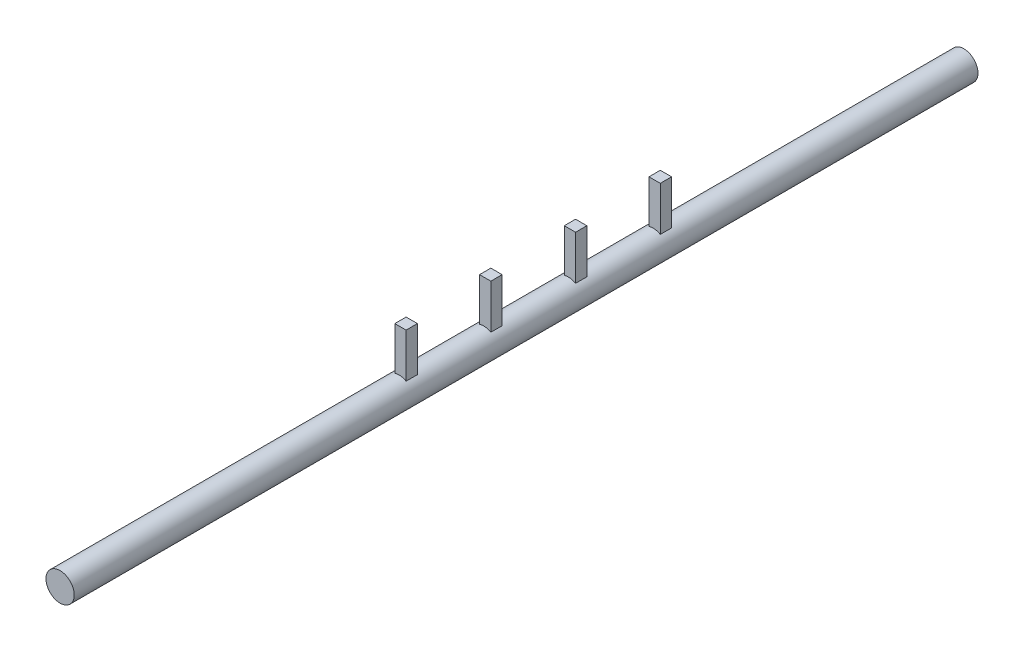
ISO-10303-21;
HEADER;
FILE_DESCRIPTION(('STEP AP214'),'2;1');
FILE_NAME('part.step','',(''),(''),'','','');
FILE_SCHEMA(('AUTOMOTIVE_DESIGN { 1 0 10303 214 1 1 1 1 }'));
ENDSEC;
DATA;
#1=APPLICATION_CONTEXT('core data for automotive mechanical design processes');
#2=APPLICATION_PROTOCOL_DEFINITION('international standard','automotive_design',2000,#1);
#3=PRODUCT_CONTEXT('',#1,'mechanical');
#4=PRODUCT('Part','Part','',(#3));
#5=PRODUCT_RELATED_PRODUCT_CATEGORY('part','',(#4));
#6=PRODUCT_DEFINITION_FORMATION('','',#4);
#7=PRODUCT_DEFINITION_CONTEXT('part definition',#1,'design');
#8=PRODUCT_DEFINITION('design','',#6,#7);
#9=PRODUCT_DEFINITION_SHAPE('','',#8);
#10=(LENGTH_UNIT() NAMED_UNIT(*) SI_UNIT(.MILLI.,.METRE.));
#11=(NAMED_UNIT(*) PLANE_ANGLE_UNIT() SI_UNIT($,.RADIAN.));
#12=(NAMED_UNIT(*) SI_UNIT($,.STERADIAN.) SOLID_ANGLE_UNIT());
#13=UNCERTAINTY_MEASURE_WITH_UNIT(LENGTH_MEASURE(1.E-05),#10,'distance_accuracy_value','');
#14=(GEOMETRIC_REPRESENTATION_CONTEXT(3) GLOBAL_UNCERTAINTY_ASSIGNED_CONTEXT((#13)) GLOBAL_UNIT_ASSIGNED_CONTEXT((#10,
#11,#12)) REPRESENTATION_CONTEXT('',''));
#15=CARTESIAN_POINT('',(0.,0.,0.));
#16=DIRECTION('',(0.,0.,1.));
#17=DIRECTION('',(1.,0.,0.));
#18=AXIS2_PLACEMENT_3D('',#15,#16,#17);
#19=CARTESIAN_POINT('',(0.,0.,203.2));
#20=DIRECTION('',(0.,0.,-1.));
#21=DIRECTION('',(-1.,0.,0.));
#22=AXIS2_PLACEMENT_3D('',#19,#20,#21);
#23=CYLINDRICAL_SURFACE('',#22,3.175);
#24=DIRECTION('',(0.,0.,-1.));
#25=VECTOR('',#24,1.);
#26=CARTESIAN_POINT('',(-0.946747637968448,3.03055999940624,203.2));
#27=LINE('',#26,#25);
#28=CARTESIAN_POINT('',(-0.946747637968447,3.03055999940624,86.36));
#29=VERTEX_POINT('',#28);
#30=CARTESIAN_POINT('',(-0.946747637968447,3.03055999940624,88.9));
#31=VERTEX_POINT('',#30);
#32=EDGE_CURVE('E317',#29,#31,#27,.F.);
#33=ORIENTED_EDGE('',*,*,#32,.F.);
#34=CARTESIAN_POINT('',(0.,0.,86.36));
#35=DIRECTION('',(0.,0.,1.));
#36=DIRECTION('',(1.,0.,0.));
#37=AXIS2_PLACEMENT_3D('',#34,#35,#36);
#38=CIRCLE('',#37,3.175);
#39=CARTESIAN_POINT('',(1.59325236203155,2.74630149671897,86.36));
#40=VERTEX_POINT('',#39);
#41=EDGE_CURVE('E305',#40,#29,#38,.T.);
#42=ORIENTED_EDGE('',*,*,#41,.F.);
#43=DIRECTION('',(0.,0.,-1.));
#44=VECTOR('',#43,1.);
#45=CARTESIAN_POINT('',(1.59325236203155,2.74630149671897,203.2));
#46=LINE('',#45,#44);
#47=CARTESIAN_POINT('',(1.59325236203155,2.74630149671897,88.9));
#48=VERTEX_POINT('',#47);
#49=EDGE_CURVE('E309',#48,#40,#46,.T.);
#50=ORIENTED_EDGE('',*,*,#49,.F.);
#51=CARTESIAN_POINT('',(0.,0.,88.9));
#52=DIRECTION('',(0.,0.,-1.));
#53=DIRECTION('',(-1.,0.,0.));
#54=AXIS2_PLACEMENT_3D('',#51,#52,#53);
#55=CIRCLE('',#54,3.175);
#56=EDGE_CURVE('E313',#31,#48,#55,.T.);
#57=ORIENTED_EDGE('',*,*,#56,.F.);
#58=EDGE_LOOP('',(#33,#42,#50,#57));
#59=FACE_BOUND('',#58,.T.);
#60=DIRECTION('',(0.,0.,-1.));
#61=VECTOR('',#60,1.);
#62=CARTESIAN_POINT('',(-0.946747637968315,3.03055999940628,203.2));
#63=LINE('',#62,#61);
#64=CARTESIAN_POINT('',(-0.946747637968314,3.03055999940628,124.46));
#65=VERTEX_POINT('',#64);
#66=CARTESIAN_POINT('',(-0.946747637968314,3.03055999940628,127.));
#67=VERTEX_POINT('',#66);
#68=EDGE_CURVE('E285',#65,#67,#63,.F.);
#69=ORIENTED_EDGE('',*,*,#68,.F.);
#70=CARTESIAN_POINT('',(0.,0.,124.46));
#71=DIRECTION('',(0.,0.,1.));
#72=DIRECTION('',(1.,0.,0.));
#73=AXIS2_PLACEMENT_3D('',#70,#71,#72);
#74=CIRCLE('',#73,3.175);
#75=CARTESIAN_POINT('',(1.59325236203168,2.7463014967189,124.46));
#76=VERTEX_POINT('',#75);
#77=EDGE_CURVE('E270',#76,#65,#74,.T.);
#78=ORIENTED_EDGE('',*,*,#77,.F.);
#79=DIRECTION('',(0.,0.,-1.));
#80=VECTOR('',#79,1.);
#81=CARTESIAN_POINT('',(1.59325236203169,2.7463014967189,203.2));
#82=LINE('',#81,#80);
#83=CARTESIAN_POINT('',(1.59325236203169,2.7463014967189,127.));
#84=VERTEX_POINT('',#83);
#85=EDGE_CURVE('E277',#84,#76,#82,.T.);
#86=ORIENTED_EDGE('',*,*,#85,.F.);
#87=CARTESIAN_POINT('',(0.,0.,127.));
#88=DIRECTION('',(0.,0.,-1.));
#89=DIRECTION('',(-1.,0.,0.));
#90=AXIS2_PLACEMENT_3D('',#87,#88,#89);
#91=CIRCLE('',#90,3.175);
#92=EDGE_CURVE('E281',#67,#84,#91,.T.);
#93=ORIENTED_EDGE('',*,*,#92,.F.);
#94=EDGE_LOOP('',(#69,#78,#86,#93));
#95=FACE_BOUND('',#94,.T.);
#96=CARTESIAN_POINT('',(0.,0.,203.2));
#97=DIRECTION('',(0.,0.,1.));
#98=DIRECTION('',(1.,0.,0.));
#99=AXIS2_PLACEMENT_3D('',#96,#97,#98);
#100=CIRCLE('',#99,3.175);
#101=CARTESIAN_POINT('',(3.175,0.,203.2));
#102=VERTEX_POINT('',#101);
#103=EDGE_CURVE('E266',#102,#102,#100,.T.);
#104=ORIENTED_EDGE('',*,*,#103,.F.);
#105=EDGE_LOOP('',(#104));
#106=FACE_BOUND('',#105,.T.);
#107=CARTESIAN_POINT('',(0.,0.,0.));
#108=DIRECTION('',(0.,0.,1.));
#109=DIRECTION('',(1.,0.,0.));
#110=AXIS2_PLACEMENT_3D('',#107,#108,#109);
#111=CIRCLE('',#110,3.175);
#112=CARTESIAN_POINT('',(3.175,0.,0.));
#113=VERTEX_POINT('',#112);
#114=EDGE_CURVE('E265',#113,#113,#111,.T.);
#115=ORIENTED_EDGE('',*,*,#114,.T.);
#116=EDGE_LOOP('',(#115));
#117=FACE_BOUND('',#116,.T.);
#118=DIRECTION('',(0.,0.,-1.));
#119=VECTOR('',#118,1.);
#120=CARTESIAN_POINT('',(-0.946747637968381,3.03055999940626,203.2));
#121=LINE('',#120,#119);
#122=CARTESIAN_POINT('',(-0.946747637968381,3.03055999940626,105.41));
#123=VERTEX_POINT('',#122);
#124=CARTESIAN_POINT('',(-0.946747637968381,3.03055999940626,107.95));
#125=VERTEX_POINT('',#124);
#126=EDGE_CURVE('E301',#123,#125,#121,.F.);
#127=ORIENTED_EDGE('',*,*,#126,.F.);
#128=CARTESIAN_POINT('',(0.,0.,105.41));
#129=DIRECTION('',(0.,0.,1.));
#130=DIRECTION('',(1.,0.,0.));
#131=AXIS2_PLACEMENT_3D('',#128,#129,#130);
#132=CIRCLE('',#131,3.175);
#133=CARTESIAN_POINT('',(1.59325236203162,2.74630149671894,105.41));
#134=VERTEX_POINT('',#133);
#135=EDGE_CURVE('E289',#134,#123,#132,.T.);
#136=ORIENTED_EDGE('',*,*,#135,.F.);
#137=DIRECTION('',(0.,0.,-1.));
#138=VECTOR('',#137,1.);
#139=CARTESIAN_POINT('',(1.59325236203162,2.74630149671894,203.2));
#140=LINE('',#139,#138);
#141=CARTESIAN_POINT('',(1.59325236203162,2.74630149671894,107.95));
#142=VERTEX_POINT('',#141);
#143=EDGE_CURVE('E293',#142,#134,#140,.T.);
#144=ORIENTED_EDGE('',*,*,#143,.F.);
#145=CARTESIAN_POINT('',(0.,0.,107.95));
#146=DIRECTION('',(0.,0.,-1.));
#147=DIRECTION('',(-1.,0.,0.));
#148=AXIS2_PLACEMENT_3D('',#145,#146,#147);
#149=CIRCLE('',#148,3.175);
#150=EDGE_CURVE('E297',#125,#142,#149,.T.);
#151=ORIENTED_EDGE('',*,*,#150,.F.);
#152=EDGE_LOOP('',(#127,#136,#144,#151));
#153=FACE_BOUND('',#152,.T.);
#154=DIRECTION('',(0.,0.,-1.));
#155=VECTOR('',#154,1.);
#156=CARTESIAN_POINT('',(-0.946747637968514,3.03055999940622,203.2));
#157=LINE('',#156,#155);
#158=CARTESIAN_POINT('',(-0.946747637968514,3.03055999940622,67.31));
#159=VERTEX_POINT('',#158);
#160=CARTESIAN_POINT('',(-0.946747637968514,3.03055999940622,69.85));
#161=VERTEX_POINT('',#160);
#162=EDGE_CURVE('E11',#159,#161,#157,.F.);
#163=ORIENTED_EDGE('',*,*,#162,.F.);
#164=CARTESIAN_POINT('',(0.,0.,67.31));
#165=DIRECTION('',(0.,0.,1.));
#166=DIRECTION('',(1.,0.,0.));
#167=AXIS2_PLACEMENT_3D('',#164,#165,#166);
#168=CIRCLE('',#167,3.175);
#169=CARTESIAN_POINT('',(1.59325236203149,2.74630149671901,67.31));
#170=VERTEX_POINT('',#169);
#171=EDGE_CURVE('E321',#170,#159,#168,.T.);
#172=ORIENTED_EDGE('',*,*,#171,.F.);
#173=DIRECTION('',(0.,0.,-1.));
#174=VECTOR('',#173,1.);
#175=CARTESIAN_POINT('',(1.59325236203149,2.74630149671901,203.2));
#176=LINE('',#175,#174);
#177=CARTESIAN_POINT('',(1.59325236203149,2.74630149671901,69.85));
#178=VERTEX_POINT('',#177);
#179=EDGE_CURVE('E57',#178,#170,#176,.T.);
#180=ORIENTED_EDGE('',*,*,#179,.F.);
#181=CARTESIAN_POINT('',(0.,0.,69.85));
#182=DIRECTION('',(0.,0.,-1.));
#183=DIRECTION('',(-1.,0.,0.));
#184=AXIS2_PLACEMENT_3D('',#181,#182,#183);
#185=CIRCLE('',#184,3.175);
#186=EDGE_CURVE('E47',#161,#178,#185,.T.);
#187=ORIENTED_EDGE('',*,*,#186,.F.);
#188=EDGE_LOOP('',(#163,#172,#180,#187));
#189=FACE_BOUND('',#188,.T.);
#190=ADVANCED_FACE('F39',(#59,#95,#106,#117,#153,#189),#23,.T.);
#191=CARTESIAN_POINT('',(0.,0.,203.2));
#192=DIRECTION('',(0.,0.,1.));
#193=DIRECTION('',(1.,0.,0.));
#194=AXIS2_PLACEMENT_3D('',#191,#192,#193);
#195=PLANE('',#194);
#196=ORIENTED_EDGE('',*,*,#103,.T.);
#197=EDGE_LOOP('',(#196));
#198=FACE_BOUND('',#197,.T.);
#199=ADVANCED_FACE('F342',(#198),#195,.T.);
#200=CARTESIAN_POINT('',(0.,0.,0.));
#201=DIRECTION('',(0.,0.,1.));
#202=DIRECTION('',(1.,0.,0.));
#203=AXIS2_PLACEMENT_3D('',#200,#201,#202);
#204=PLANE('',#203);
#205=ORIENTED_EDGE('',*,*,#114,.F.);
#206=EDGE_LOOP('',(#205));
#207=FACE_BOUND('',#206,.T.);
#208=ADVANCED_FACE('F349',(#207),#204,.F.);
#209=CARTESIAN_POINT('',(-0.946747637968315,12.7,127.));
#210=DIRECTION('',(1.,0.,0.));
#211=DIRECTION('',(0.,0.,-1.));
#212=AXIS2_PLACEMENT_3D('',#209,#210,#211);
#213=PLANE('',#212);
#214=DIRECTION('',(0.,-1.,0.));
#215=VECTOR('',#214,1.);
#216=CARTESIAN_POINT('',(-0.946747637968315,12.7,124.46));
#217=LINE('',#216,#215);
#218=CARTESIAN_POINT('',(-0.946747637968315,12.7,124.46));
#219=VERTEX_POINT('',#218);
#220=EDGE_CURVE('E249',#219,#65,#217,.T.);
#221=ORIENTED_EDGE('',*,*,#220,.T.);
#222=ORIENTED_EDGE('',*,*,#68,.T.);
#223=DIRECTION('',(0.,-1.,0.));
#224=VECTOR('',#223,1.);
#225=CARTESIAN_POINT('',(-0.946747637968315,12.7,127.));
#226=LINE('',#225,#224);
#227=CARTESIAN_POINT('',(-0.946747637968315,12.7,127.));
#228=VERTEX_POINT('',#227);
#229=EDGE_CURVE('E261',#228,#67,#226,.T.);
#230=ORIENTED_EDGE('',*,*,#229,.F.);
#231=DIRECTION('',(0.,0.,1.));
#232=VECTOR('',#231,1.);
#233=CARTESIAN_POINT('',(-0.946747637968315,12.7,127.));
#234=LINE('',#233,#232);
#235=EDGE_CURVE('E236',#219,#228,#234,.T.);
#236=ORIENTED_EDGE('',*,*,#235,.F.);
#237=EDGE_LOOP('',(#221,#222,#230,#236));
#238=FACE_BOUND('',#237,.T.);
#239=ADVANCED_FACE('F398',(#238),#213,.F.);
#240=CARTESIAN_POINT('',(1.59325236203169,12.7,127.));
#241=DIRECTION('',(-1.,0.,0.));
#242=DIRECTION('',(0.,0.,1.));
#243=AXIS2_PLACEMENT_3D('',#240,#241,#242);
#244=PLANE('',#243);
#245=DIRECTION('',(0.,-1.,0.));
#246=VECTOR('',#245,1.);
#247=CARTESIAN_POINT('',(1.59325236203169,12.7,127.));
#248=LINE('',#247,#246);
#249=CARTESIAN_POINT('',(1.59325236203169,12.7,127.));
#250=VERTEX_POINT('',#249);
#251=EDGE_CURVE('E257',#250,#84,#248,.T.);
#252=ORIENTED_EDGE('',*,*,#251,.T.);
#253=ORIENTED_EDGE('',*,*,#85,.T.);
#254=DIRECTION('',(0.,-1.,0.));
#255=VECTOR('',#254,1.);
#256=CARTESIAN_POINT('',(1.59325236203169,12.7,124.46));
#257=LINE('',#256,#255);
#258=CARTESIAN_POINT('',(1.59325236203169,12.7,124.46));
#259=VERTEX_POINT('',#258);
#260=EDGE_CURVE('E253',#259,#76,#257,.T.);
#261=ORIENTED_EDGE('',*,*,#260,.F.);
#262=DIRECTION('',(0.,0.,-1.));
#263=VECTOR('',#262,1.);
#264=CARTESIAN_POINT('',(1.59325236203169,12.7,127.));
#265=LINE('',#264,#263);
#266=EDGE_CURVE('E243',#250,#259,#265,.T.);
#267=ORIENTED_EDGE('',*,*,#266,.F.);
#268=EDGE_LOOP('',(#252,#253,#261,#267));
#269=FACE_BOUND('',#268,.T.);
#270=ADVANCED_FACE('F395',(#269),#244,.F.);
#271=CARTESIAN_POINT('',(-0.946747637968315,12.7,127.));
#272=DIRECTION('',(0.,0.,-1.));
#273=DIRECTION('',(-1.,0.,0.));
#274=AXIS2_PLACEMENT_3D('',#271,#272,#273);
#275=PLANE('',#274);
#276=ORIENTED_EDGE('',*,*,#229,.T.);
#277=ORIENTED_EDGE('',*,*,#92,.T.);
#278=ORIENTED_EDGE('',*,*,#251,.F.);
#279=DIRECTION('',(1.,0.,0.));
#280=VECTOR('',#279,1.);
#281=CARTESIAN_POINT('',(-0.946747637968315,12.7,127.));
#282=LINE('',#281,#280);
#283=EDGE_CURVE('E240',#228,#250,#282,.T.);
#284=ORIENTED_EDGE('',*,*,#283,.F.);
#285=EDGE_LOOP('',(#276,#277,#278,#284));
#286=FACE_BOUND('',#285,.T.);
#287=ADVANCED_FACE('F393',(#286),#275,.F.);
#288=CARTESIAN_POINT('',(-0.946747637968315,12.7,124.46));
#289=DIRECTION('',(0.,0.,1.));
#290=DIRECTION('',(1.,0.,0.));
#291=AXIS2_PLACEMENT_3D('',#288,#289,#290);
#292=PLANE('',#291);
#293=ORIENTED_EDGE('',*,*,#260,.T.);
#294=ORIENTED_EDGE('',*,*,#77,.T.);
#295=ORIENTED_EDGE('',*,*,#220,.F.);
#296=DIRECTION('',(-1.,0.,0.));
#297=VECTOR('',#296,1.);
#298=CARTESIAN_POINT('',(-0.946747637968315,12.7,124.46));
#299=LINE('',#298,#297);
#300=EDGE_CURVE('E246',#259,#219,#299,.T.);
#301=ORIENTED_EDGE('',*,*,#300,.F.);
#302=EDGE_LOOP('',(#293,#294,#295,#301));
#303=FACE_BOUND('',#302,.T.);
#304=ADVANCED_FACE('F389',(#303),#292,.F.);
#305=CARTESIAN_POINT('',(0.,12.7,0.));
#306=DIRECTION('',(0.,-1.,0.));
#307=DIRECTION('',(0.,0.,-1.));
#308=AXIS2_PLACEMENT_3D('',#305,#306,#307);
#309=PLANE('',#308);
#310=ORIENTED_EDGE('',*,*,#235,.T.);
#311=ORIENTED_EDGE('',*,*,#283,.T.);
#312=ORIENTED_EDGE('',*,*,#266,.T.);
#313=ORIENTED_EDGE('',*,*,#300,.T.);
#314=EDGE_LOOP('',(#310,#311,#312,#313));
#315=FACE_BOUND('',#314,.T.);
#316=ADVANCED_FACE('F386',(#315),#309,.F.);
#317=CARTESIAN_POINT('',(-0.946747637968381,12.7,107.95));
#318=DIRECTION('',(1.,0.,0.));
#319=DIRECTION('',(0.,0.,-1.));
#320=AXIS2_PLACEMENT_3D('',#317,#318,#319);
#321=PLANE('',#320);
#322=DIRECTION('',(0.,-1.,0.));
#323=VECTOR('',#322,1.);
#324=CARTESIAN_POINT('',(-0.946747637968381,12.7,105.41));
#325=LINE('',#324,#323);
#326=CARTESIAN_POINT('',(-0.946747637968381,12.7,105.41));
#327=VERTEX_POINT('',#326);
#328=EDGE_CURVE('E220',#327,#123,#325,.T.);
#329=ORIENTED_EDGE('',*,*,#328,.T.);
#330=ORIENTED_EDGE('',*,*,#126,.T.);
#331=DIRECTION('',(0.,-1.,0.));
#332=VECTOR('',#331,1.);
#333=CARTESIAN_POINT('',(-0.946747637968381,12.7,107.95));
#334=LINE('',#333,#332);
#335=CARTESIAN_POINT('',(-0.946747637968381,12.7,107.95));
#336=VERTEX_POINT('',#335);
#337=EDGE_CURVE('E232',#336,#125,#334,.T.);
#338=ORIENTED_EDGE('',*,*,#337,.F.);
#339=DIRECTION('',(0.,0.,1.));
#340=VECTOR('',#339,1.);
#341=CARTESIAN_POINT('',(-0.946747637968381,12.7,107.95));
#342=LINE('',#341,#340);
#343=EDGE_CURVE('E207',#327,#336,#342,.T.);
#344=ORIENTED_EDGE('',*,*,#343,.F.);
#345=EDGE_LOOP('',(#329,#330,#338,#344));
#346=FACE_BOUND('',#345,.T.);
#347=ADVANCED_FACE('F366',(#346),#321,.F.);
#348=CARTESIAN_POINT('',(1.59325236203162,12.7,107.95));
#349=DIRECTION('',(-1.,0.,0.));
#350=DIRECTION('',(0.,0.,1.));
#351=AXIS2_PLACEMENT_3D('',#348,#349,#350);
#352=PLANE('',#351);
#353=DIRECTION('',(0.,-1.,0.));
#354=VECTOR('',#353,1.);
#355=CARTESIAN_POINT('',(1.59325236203162,12.7,107.95));
#356=LINE('',#355,#354);
#357=CARTESIAN_POINT('',(1.59325236203162,12.7,107.95));
#358=VERTEX_POINT('',#357);
#359=EDGE_CURVE('E228',#358,#142,#356,.T.);
#360=ORIENTED_EDGE('',*,*,#359,.T.);
#361=ORIENTED_EDGE('',*,*,#143,.T.);
#362=DIRECTION('',(0.,-1.,0.));
#363=VECTOR('',#362,1.);
#364=CARTESIAN_POINT('',(1.59325236203162,12.7,105.41));
#365=LINE('',#364,#363);
#366=CARTESIAN_POINT('',(1.59325236203162,12.7,105.41));
#367=VERTEX_POINT('',#366);
#368=EDGE_CURVE('E224',#367,#134,#365,.T.);
#369=ORIENTED_EDGE('',*,*,#368,.F.);
#370=DIRECTION('',(0.,0.,-1.));
#371=VECTOR('',#370,1.);
#372=CARTESIAN_POINT('',(1.59325236203162,12.7,107.95));
#373=LINE('',#372,#371);
#374=EDGE_CURVE('E214',#358,#367,#373,.T.);
#375=ORIENTED_EDGE('',*,*,#374,.F.);
#376=EDGE_LOOP('',(#360,#361,#369,#375));
#377=FACE_BOUND('',#376,.T.);
#378=ADVANCED_FACE('F372',(#377),#352,.F.);
#379=CARTESIAN_POINT('',(-0.946747637968381,12.7,107.95));
#380=DIRECTION('',(0.,0.,-1.));
#381=DIRECTION('',(-1.,0.,0.));
#382=AXIS2_PLACEMENT_3D('',#379,#380,#381);
#383=PLANE('',#382);
#384=ORIENTED_EDGE('',*,*,#337,.T.);
#385=ORIENTED_EDGE('',*,*,#150,.T.);
#386=ORIENTED_EDGE('',*,*,#359,.F.);
#387=DIRECTION('',(1.,0.,0.));
#388=VECTOR('',#387,1.);
#389=CARTESIAN_POINT('',(-0.946747637968381,12.7,107.95));
#390=LINE('',#389,#388);
#391=EDGE_CURVE('E211',#336,#358,#390,.T.);
#392=ORIENTED_EDGE('',*,*,#391,.F.);
#393=EDGE_LOOP('',(#384,#385,#386,#392));
#394=FACE_BOUND('',#393,.T.);
#395=ADVANCED_FACE('F374',(#394),#383,.F.);
#396=CARTESIAN_POINT('',(-0.946747637968381,12.7,105.41));
#397=DIRECTION('',(0.,0.,1.));
#398=DIRECTION('',(1.,0.,0.));
#399=AXIS2_PLACEMENT_3D('',#396,#397,#398);
#400=PLANE('',#399);
#401=ORIENTED_EDGE('',*,*,#368,.T.);
#402=ORIENTED_EDGE('',*,*,#135,.T.);
#403=ORIENTED_EDGE('',*,*,#328,.F.);
#404=DIRECTION('',(-1.,0.,0.));
#405=VECTOR('',#404,1.);
#406=CARTESIAN_POINT('',(-0.946747637968381,12.7,105.41));
#407=LINE('',#406,#405);
#408=EDGE_CURVE('E217',#367,#327,#407,.T.);
#409=ORIENTED_EDGE('',*,*,#408,.F.);
#410=EDGE_LOOP('',(#401,#402,#403,#409));
#411=FACE_BOUND('',#410,.T.);
#412=ADVANCED_FACE('F362',(#411),#400,.F.);
#413=CARTESIAN_POINT('',(0.,12.7,0.));
#414=DIRECTION('',(0.,-1.,0.));
#415=DIRECTION('',(0.,0.,-1.));
#416=AXIS2_PLACEMENT_3D('',#413,#414,#415);
#417=PLANE('',#416);
#418=ORIENTED_EDGE('',*,*,#343,.T.);
#419=ORIENTED_EDGE('',*,*,#391,.T.);
#420=ORIENTED_EDGE('',*,*,#374,.T.);
#421=ORIENTED_EDGE('',*,*,#408,.T.);
#422=EDGE_LOOP('',(#418,#419,#420,#421));
#423=FACE_BOUND('',#422,.T.);
#424=ADVANCED_FACE('F368',(#423),#417,.F.);
#425=CARTESIAN_POINT('',(-0.946747637968448,12.7,88.9));
#426=DIRECTION('',(1.,0.,0.));
#427=DIRECTION('',(0.,0.,-1.));
#428=AXIS2_PLACEMENT_3D('',#425,#426,#427);
#429=PLANE('',#428);
#430=DIRECTION('',(0.,-1.,0.));
#431=VECTOR('',#430,1.);
#432=CARTESIAN_POINT('',(-0.946747637968448,12.7,86.36));
#433=LINE('',#432,#431);
#434=CARTESIAN_POINT('',(-0.946747637968448,12.7,86.36));
#435=VERTEX_POINT('',#434);
#436=EDGE_CURVE('E191',#435,#29,#433,.T.);
#437=ORIENTED_EDGE('',*,*,#436,.T.);
#438=ORIENTED_EDGE('',*,*,#32,.T.);
#439=DIRECTION('',(0.,-1.,0.));
#440=VECTOR('',#439,1.);
#441=CARTESIAN_POINT('',(-0.946747637968448,12.7,88.9));
#442=LINE('',#441,#440);
#443=CARTESIAN_POINT('',(-0.946747637968448,12.7,88.9));
#444=VERTEX_POINT('',#443);
#445=EDGE_CURVE('E203',#444,#31,#442,.T.);
#446=ORIENTED_EDGE('',*,*,#445,.F.);
#447=DIRECTION('',(0.,0.,1.));
#448=VECTOR('',#447,1.);
#449=CARTESIAN_POINT('',(-0.946747637968448,12.7,88.9));
#450=LINE('',#449,#448);
#451=EDGE_CURVE('E172',#435,#444,#450,.T.);
#452=ORIENTED_EDGE('',*,*,#451,.F.);
#453=EDGE_LOOP('',(#437,#438,#446,#452));
#454=FACE_BOUND('',#453,.T.);
#455=ADVANCED_FACE('F460',(#454),#429,.F.);
#456=CARTESIAN_POINT('',(1.59325236203155,12.7,88.9));
#457=DIRECTION('',(-1.,0.,0.));
#458=DIRECTION('',(0.,0.,1.));
#459=AXIS2_PLACEMENT_3D('',#456,#457,#458);
#460=PLANE('',#459);
#461=DIRECTION('',(0.,-1.,0.));
#462=VECTOR('',#461,1.);
#463=CARTESIAN_POINT('',(1.59325236203155,12.7,88.9));
#464=LINE('',#463,#462);
#465=CARTESIAN_POINT('',(1.59325236203155,12.7,88.9));
#466=VERTEX_POINT('',#465);
#467=EDGE_CURVE('E199',#466,#48,#464,.T.);
#468=ORIENTED_EDGE('',*,*,#467,.T.);
#469=ORIENTED_EDGE('',*,*,#49,.T.);
#470=DIRECTION('',(0.,-1.,0.));
#471=VECTOR('',#470,1.);
#472=CARTESIAN_POINT('',(1.59325236203155,12.7,86.36));
#473=LINE('',#472,#471);
#474=CARTESIAN_POINT('',(1.59325236203155,12.7,86.36));
#475=VERTEX_POINT('',#474);
#476=EDGE_CURVE('E195',#475,#40,#473,.T.);
#477=ORIENTED_EDGE('',*,*,#476,.F.);
#478=DIRECTION('',(0.,0.,-1.));
#479=VECTOR('',#478,1.);
#480=CARTESIAN_POINT('',(1.59325236203155,12.7,88.9));
#481=LINE('',#480,#479);
#482=EDGE_CURVE('E185',#466,#475,#481,.T.);
#483=ORIENTED_EDGE('',*,*,#482,.F.);
#484=EDGE_LOOP('',(#468,#469,#477,#483));
#485=FACE_BOUND('',#484,.T.);
#486=ADVANCED_FACE('F469',(#485),#460,.F.);
#487=CARTESIAN_POINT('',(-0.946747637968448,12.7,88.9));
#488=DIRECTION('',(0.,0.,-1.));
#489=DIRECTION('',(-1.,0.,0.));
#490=AXIS2_PLACEMENT_3D('',#487,#488,#489);
#491=PLANE('',#490);
#492=ORIENTED_EDGE('',*,*,#445,.T.);
#493=ORIENTED_EDGE('',*,*,#56,.T.);
#494=ORIENTED_EDGE('',*,*,#467,.F.);
#495=DIRECTION('',(1.,0.,0.));
#496=VECTOR('',#495,1.);
#497=CARTESIAN_POINT('',(-0.946747637968448,12.7,88.9));
#498=LINE('',#497,#496);
#499=EDGE_CURVE('E177',#444,#466,#498,.T.);
#500=ORIENTED_EDGE('',*,*,#499,.F.);
#501=EDGE_LOOP('',(#492,#493,#494,#500));
#502=FACE_BOUND('',#501,.T.);
#503=ADVANCED_FACE('F479',(#502),#491,.F.);
#504=CARTESIAN_POINT('',(-0.946747637968448,12.7,86.36));
#505=DIRECTION('',(0.,0.,1.));
#506=DIRECTION('',(1.,0.,0.));
#507=AXIS2_PLACEMENT_3D('',#504,#505,#506);
#508=PLANE('',#507);
#509=ORIENTED_EDGE('',*,*,#476,.T.);
#510=ORIENTED_EDGE('',*,*,#41,.T.);
#511=ORIENTED_EDGE('',*,*,#436,.F.);
#512=DIRECTION('',(-1.,0.,0.));
#513=VECTOR('',#512,1.);
#514=CARTESIAN_POINT('',(-0.946747637968448,12.7,86.36));
#515=LINE('',#514,#513);
#516=EDGE_CURVE('E188',#475,#435,#515,.T.);
#517=ORIENTED_EDGE('',*,*,#516,.F.);
#518=EDGE_LOOP('',(#509,#510,#511,#517));
#519=FACE_BOUND('',#518,.T.);
#520=ADVANCED_FACE('F489',(#519),#508,.F.);
#521=CARTESIAN_POINT('',(0.,12.7,0.));
#522=DIRECTION('',(0.,-1.,0.));
#523=DIRECTION('',(0.,0.,-1.));
#524=AXIS2_PLACEMENT_3D('',#521,#522,#523);
#525=PLANE('',#524);
#526=ORIENTED_EDGE('',*,*,#451,.T.);
#527=ORIENTED_EDGE('',*,*,#499,.T.);
#528=ORIENTED_EDGE('',*,*,#482,.T.);
#529=ORIENTED_EDGE('',*,*,#516,.T.);
#530=EDGE_LOOP('',(#526,#527,#528,#529));
#531=FACE_BOUND('',#530,.T.);
#532=ADVANCED_FACE('F499',(#531),#525,.F.);
#533=CARTESIAN_POINT('',(-0.946747637968514,12.7,69.85));
#534=DIRECTION('',(1.,0.,0.));
#535=DIRECTION('',(0.,0.,-1.));
#536=AXIS2_PLACEMENT_3D('',#533,#534,#535);
#537=PLANE('',#536);
#538=DIRECTION('',(0.,-1.,0.));
#539=VECTOR('',#538,1.);
#540=CARTESIAN_POINT('',(-0.946747637968514,12.7,67.31));
#541=LINE('',#540,#539);
#542=CARTESIAN_POINT('',(-0.946747637968514,12.7,67.31));
#543=VERTEX_POINT('',#542);
#544=EDGE_CURVE('E334',#543,#159,#541,.T.);
#545=ORIENTED_EDGE('',*,*,#544,.T.);
#546=ORIENTED_EDGE('',*,*,#162,.T.);
#547=DIRECTION('',(0.,-1.,0.));
#548=VECTOR('',#547,1.);
#549=CARTESIAN_POINT('',(-0.946747637968514,12.7,69.85));
#550=LINE('',#549,#548);
#551=CARTESIAN_POINT('',(-0.946747637968514,12.7,69.85));
#552=VERTEX_POINT('',#551);
#553=EDGE_CURVE('E152',#552,#161,#550,.T.);
#554=ORIENTED_EDGE('',*,*,#553,.F.);
#555=DIRECTION('',(0.,0.,1.));
#556=VECTOR('',#555,1.);
#557=CARTESIAN_POINT('',(-0.946747637968514,12.7,69.85));
#558=LINE('',#557,#556);
#559=EDGE_CURVE('E159',#543,#552,#558,.T.);
#560=ORIENTED_EDGE('',*,*,#559,.F.);
#561=EDGE_LOOP('',(#545,#546,#554,#560));
#562=FACE_BOUND('',#561,.T.);
#563=ADVANCED_FACE('F170',(#562),#537,.F.);
#564=CARTESIAN_POINT('',(1.59325236203149,12.7,69.85));
#565=DIRECTION('',(-1.,0.,0.));
#566=DIRECTION('',(0.,0.,1.));
#567=AXIS2_PLACEMENT_3D('',#564,#565,#566);
#568=PLANE('',#567);
#569=DIRECTION('',(0.,-1.,0.));
#570=VECTOR('',#569,1.);
#571=CARTESIAN_POINT('',(1.59325236203149,12.7,69.85));
#572=LINE('',#571,#570);
#573=CARTESIAN_POINT('',(1.59325236203149,12.7,69.85));
#574=VERTEX_POINT('',#573);
#575=EDGE_CURVE('E154',#574,#178,#572,.T.);
#576=ORIENTED_EDGE('',*,*,#575,.T.);
#577=ORIENTED_EDGE('',*,*,#179,.T.);
#578=DIRECTION('',(0.,-1.,0.));
#579=VECTOR('',#578,1.);
#580=CARTESIAN_POINT('',(1.59325236203149,12.7,67.31));
#581=LINE('',#580,#579);
#582=CARTESIAN_POINT('',(1.59325236203149,12.7,67.31));
#583=VERTEX_POINT('',#582);
#584=EDGE_CURVE('E179',#583,#170,#581,.T.);
#585=ORIENTED_EDGE('',*,*,#584,.F.);
#586=DIRECTION('',(0.,0.,-1.));
#587=VECTOR('',#586,1.);
#588=CARTESIAN_POINT('',(1.59325236203149,12.7,69.85));
#589=LINE('',#588,#587);
#590=EDGE_CURVE('E158',#574,#583,#589,.T.);
#591=ORIENTED_EDGE('',*,*,#590,.F.);
#592=EDGE_LOOP('',(#576,#577,#585,#591));
#593=FACE_BOUND('',#592,.T.);
#594=ADVANCED_FACE('F328',(#593),#568,.F.);
#595=CARTESIAN_POINT('',(-0.946747637968514,12.7,69.85));
#596=DIRECTION('',(0.,0.,-1.));
#597=DIRECTION('',(-1.,0.,0.));
#598=AXIS2_PLACEMENT_3D('',#595,#596,#597);
#599=PLANE('',#598);
#600=ORIENTED_EDGE('',*,*,#553,.T.);
#601=ORIENTED_EDGE('',*,*,#186,.T.);
#602=ORIENTED_EDGE('',*,*,#575,.F.);
#603=DIRECTION('',(1.,0.,0.));
#604=VECTOR('',#603,1.);
#605=CARTESIAN_POINT('',(-0.946747637968514,12.7,69.85));
#606=LINE('',#605,#604);
#607=EDGE_CURVE('E148',#552,#574,#606,.T.);
#608=ORIENTED_EDGE('',*,*,#607,.F.);
#609=EDGE_LOOP('',(#600,#601,#602,#608));
#610=FACE_BOUND('',#609,.T.);
#611=ADVANCED_FACE('F150',(#610),#599,.F.);
#612=CARTESIAN_POINT('',(-0.946747637968514,12.7,67.31));
#613=DIRECTION('',(0.,0.,1.));
#614=DIRECTION('',(1.,0.,0.));
#615=AXIS2_PLACEMENT_3D('',#612,#613,#614);
#616=PLANE('',#615);
#617=ORIENTED_EDGE('',*,*,#584,.T.);
#618=ORIENTED_EDGE('',*,*,#171,.T.);
#619=ORIENTED_EDGE('',*,*,#544,.F.);
#620=DIRECTION('',(-1.,0.,0.));
#621=VECTOR('',#620,1.);
#622=CARTESIAN_POINT('',(-0.946747637968514,12.7,67.31));
#623=LINE('',#622,#621);
#624=EDGE_CURVE('E164',#583,#543,#623,.T.);
#625=ORIENTED_EDGE('',*,*,#624,.F.);
#626=EDGE_LOOP('',(#617,#618,#619,#625));
#627=FACE_BOUND('',#626,.T.);
#628=ADVANCED_FACE('F340',(#627),#616,.F.);
#629=CARTESIAN_POINT('',(0.,12.7,0.));
#630=DIRECTION('',(0.,-1.,0.));
#631=DIRECTION('',(0.,0.,-1.));
#632=AXIS2_PLACEMENT_3D('',#629,#630,#631);
#633=PLANE('',#632);
#634=ORIENTED_EDGE('',*,*,#559,.T.);
#635=ORIENTED_EDGE('',*,*,#607,.T.);
#636=ORIENTED_EDGE('',*,*,#590,.T.);
#637=ORIENTED_EDGE('',*,*,#624,.T.);
#638=EDGE_LOOP('',(#634,#635,#636,#637));
#639=FACE_BOUND('',#638,.T.);
#640=ADVANCED_FACE('F162',(#639),#633,.F.);
#641=CLOSED_SHELL('',(#190,#199,#208,#239,#270,#287,#304,#316,#347,#378,#395,#412,#424,#455,
#486,#503,#520,#532,#563,#594,#611,#628,#640));
#642=MANIFOLD_SOLID_BREP('B2',#641);
#643=ADVANCED_BREP_SHAPE_REPRESENTATION('',(#18,#642),#14);
#644=SHAPE_DEFINITION_REPRESENTATION(#9,#643);
ENDSEC;
END-ISO-10303-21;
